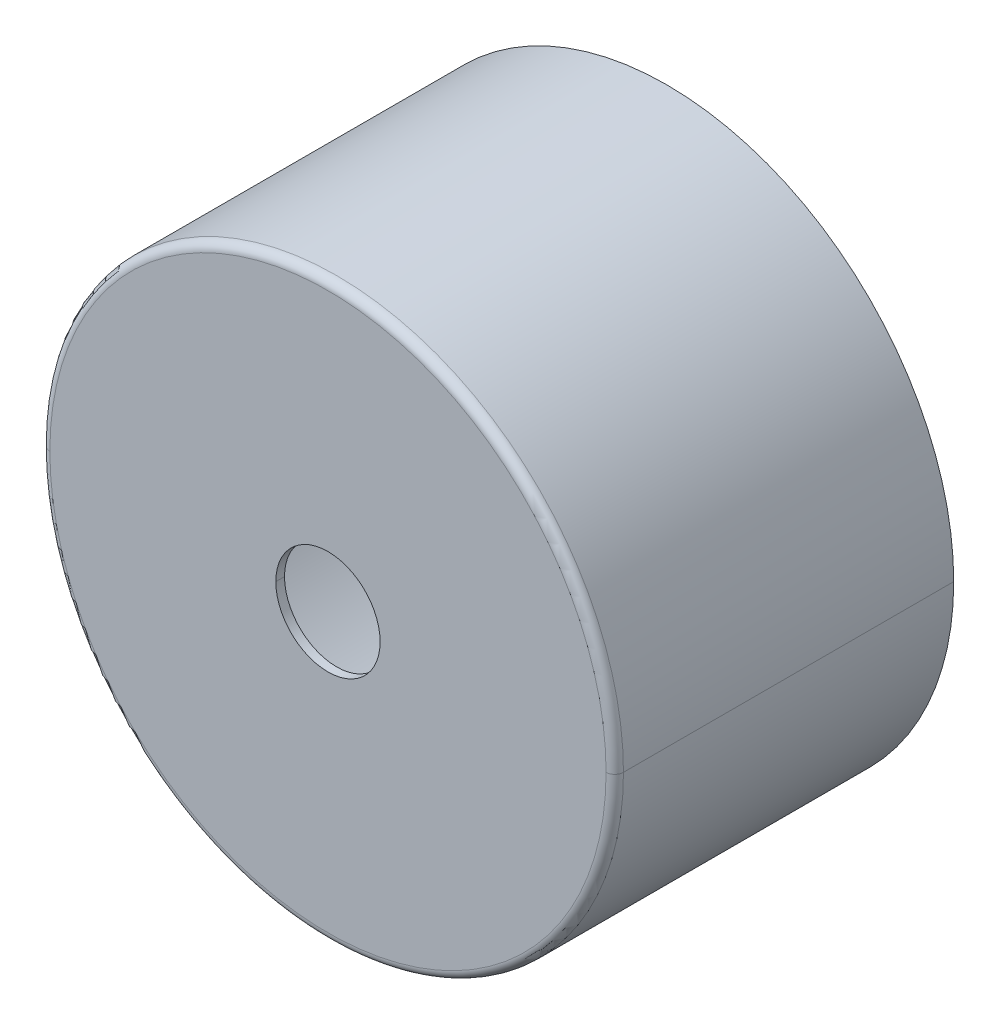
ISO-10303-21;
HEADER;
FILE_DESCRIPTION(('STEP AP214'),'2;1');
FILE_NAME('part.step','',(''),(''),'','','');
FILE_SCHEMA(('AUTOMOTIVE_DESIGN { 1 0 10303 214 1 1 1 1 }'));
ENDSEC;
DATA;
#1=APPLICATION_CONTEXT('core data for automotive mechanical design processes');
#2=APPLICATION_PROTOCOL_DEFINITION('international standard','automotive_design',2000,#1);
#3=PRODUCT_CONTEXT('',#1,'mechanical');
#4=PRODUCT('Part','Part','',(#3));
#5=PRODUCT_RELATED_PRODUCT_CATEGORY('part','',(#4));
#6=PRODUCT_DEFINITION_FORMATION('','',#4);
#7=PRODUCT_DEFINITION_CONTEXT('part definition',#1,'design');
#8=PRODUCT_DEFINITION('design','',#6,#7);
#9=PRODUCT_DEFINITION_SHAPE('','',#8);
#10=(LENGTH_UNIT() NAMED_UNIT(*) SI_UNIT(.MILLI.,.METRE.));
#11=(NAMED_UNIT(*) PLANE_ANGLE_UNIT() SI_UNIT($,.RADIAN.));
#12=(NAMED_UNIT(*) SI_UNIT($,.STERADIAN.) SOLID_ANGLE_UNIT());
#13=UNCERTAINTY_MEASURE_WITH_UNIT(LENGTH_MEASURE(1.E-05),#10,'distance_accuracy_value','');
#14=(GEOMETRIC_REPRESENTATION_CONTEXT(3) GLOBAL_UNCERTAINTY_ASSIGNED_CONTEXT((#13)) GLOBAL_UNIT_ASSIGNED_CONTEXT((#10,
#11,#12)) REPRESENTATION_CONTEXT('',''));
#15=CARTESIAN_POINT('',(0.,0.,0.));
#16=DIRECTION('',(0.,0.,1.));
#17=DIRECTION('',(1.,0.,0.));
#18=AXIS2_PLACEMENT_3D('',#15,#16,#17);
#19=CARTESIAN_POINT('',(0.,0.,-0.5));
#20=DIRECTION('',(0.,0.,1.));
#21=DIRECTION('',(1.,0.,0.));
#22=AXIS2_PLACEMENT_3D('',#19,#20,#21);
#23=TOROIDAL_SURFACE('',#22,16.,0.5);
#24=CARTESIAN_POINT('',(-16.,0.,-0.5));
#25=DIRECTION('',(0.,1.,0.));
#26=DIRECTION('',(-1.,0.,0.));
#27=AXIS2_PLACEMENT_3D('',#24,#25,#26);
#28=CIRCLE('',#27,0.5);
#29=CARTESIAN_POINT('',(-16.5,0.,-0.5));
#30=VERTEX_POINT('',#29);
#31=CARTESIAN_POINT('',(-16.,0.,0.));
#32=VERTEX_POINT('',#31);
#33=EDGE_CURVE('E132',#30,#32,#28,.T.);
#34=ORIENTED_EDGE('',*,*,#33,.F.);
#35=CARTESIAN_POINT('',(0.,0.,-0.5));
#36=DIRECTION('',(0.,0.,-1.));
#37=DIRECTION('',(1.,0.,0.));
#38=AXIS2_PLACEMENT_3D('',#35,#36,#37);
#39=CIRCLE('',#38,16.5);
#40=CARTESIAN_POINT('',(16.5,0.,-0.5));
#41=VERTEX_POINT('',#40);
#42=EDGE_CURVE('E168',#41,#30,#39,.T.);
#43=ORIENTED_EDGE('',*,*,#42,.F.);
#44=CARTESIAN_POINT('',(16.,0.,-0.5));
#45=DIRECTION('',(0.,-1.,0.));
#46=DIRECTION('',(0.,0.,-1.));
#47=AXIS2_PLACEMENT_3D('',#44,#45,#46);
#48=CIRCLE('',#47,0.5);
#49=CARTESIAN_POINT('',(16.,0.,0.));
#50=VERTEX_POINT('',#49);
#51=EDGE_CURVE('E120',#41,#50,#48,.T.);
#52=ORIENTED_EDGE('',*,*,#51,.T.);
#53=CARTESIAN_POINT('',(0.,0.,0.));
#54=DIRECTION('',(0.,0.,1.));
#55=DIRECTION('',(1.,0.,0.));
#56=AXIS2_PLACEMENT_3D('',#53,#54,#55);
#57=CIRCLE('',#56,16.);
#58=EDGE_CURVE('E21',#32,#50,#57,.T.);
#59=ORIENTED_EDGE('',*,*,#58,.F.);
#60=EDGE_LOOP('',(#34,#43,#52,#59));
#61=FACE_BOUND('',#60,.T.);
#62=ADVANCED_FACE('F17',(#61),#23,.T.);
#63=CARTESIAN_POINT('',(0.,0.,-19.5));
#64=DIRECTION('',(0.,0.,1.));
#65=DIRECTION('',(1.,0.,0.));
#66=AXIS2_PLACEMENT_3D('',#63,#64,#65);
#67=CYLINDRICAL_SURFACE('',#66,3.);
#68=DIRECTION('',(0.,0.,1.));
#69=VECTOR('',#68,1.);
#70=CARTESIAN_POINT('',(-3.,0.,-19.5));
#71=LINE('',#70,#69);
#72=CARTESIAN_POINT('',(-3.,0.,-0.5));
#73=VERTEX_POINT('',#72);
#74=CARTESIAN_POINT('',(-3.,0.,0.));
#75=VERTEX_POINT('',#74);
#76=EDGE_CURVE('E97',#73,#75,#71,.T.);
#77=ORIENTED_EDGE('',*,*,#76,.F.);
#78=CARTESIAN_POINT('',(0.,0.,-0.5));
#79=DIRECTION('',(0.,0.,1.));
#80=DIRECTION('',(1.,0.,0.));
#81=AXIS2_PLACEMENT_3D('',#78,#79,#80);
#82=CIRCLE('',#81,3.);
#83=CARTESIAN_POINT('',(3.,0.,-0.5));
#84=VERTEX_POINT('',#83);
#85=EDGE_CURVE('E11',#84,#73,#82,.T.);
#86=ORIENTED_EDGE('',*,*,#85,.F.);
#87=DIRECTION('',(0.,0.,1.));
#88=VECTOR('',#87,1.);
#89=CARTESIAN_POINT('',(3.,0.,-19.5));
#90=LINE('',#89,#88);
#91=CARTESIAN_POINT('',(3.,0.,0.));
#92=VERTEX_POINT('',#91);
#93=EDGE_CURVE('E100',#84,#92,#90,.T.);
#94=ORIENTED_EDGE('',*,*,#93,.T.);
#95=CARTESIAN_POINT('',(0.,0.,0.));
#96=DIRECTION('',(0.,0.,1.));
#97=DIRECTION('',(1.,0.,0.));
#98=AXIS2_PLACEMENT_3D('',#95,#96,#97);
#99=CIRCLE('',#98,3.);
#100=EDGE_CURVE('E94',#92,#75,#99,.T.);
#101=ORIENTED_EDGE('',*,*,#100,.T.);
#102=EDGE_LOOP('',(#77,#86,#94,#101));
#103=FACE_BOUND('',#102,.T.);
#104=ADVANCED_FACE('F19',(#103),#67,.F.);
#105=CARTESIAN_POINT('',(0.,0.,-0.5));
#106=DIRECTION('',(0.,0.,1.));
#107=DIRECTION('',(1.,0.,0.));
#108=AXIS2_PLACEMENT_3D('',#105,#106,#107);
#109=PLANE('',#108);
#110=ORIENTED_EDGE('',*,*,#85,.T.);
#111=CARTESIAN_POINT('',(0.,0.,-0.5));
#112=DIRECTION('',(0.,0.,1.));
#113=DIRECTION('',(1.,0.,0.));
#114=AXIS2_PLACEMENT_3D('',#111,#112,#113);
#115=CIRCLE('',#114,3.);
#116=EDGE_CURVE('E113',#73,#84,#115,.T.);
#117=ORIENTED_EDGE('',*,*,#116,.T.);
#118=EDGE_LOOP('',(#110,#117));
#119=FACE_BOUND('',#118,.T.);
#120=CARTESIAN_POINT('',(0.,0.,-0.5));
#121=DIRECTION('',(0.,0.,1.));
#122=DIRECTION('',(1.,0.,0.));
#123=AXIS2_PLACEMENT_3D('',#120,#121,#122);
#124=CIRCLE('',#123,16.);
#125=CARTESIAN_POINT('',(16.,0.,-0.5));
#126=VERTEX_POINT('',#125);
#127=CARTESIAN_POINT('',(-16.,0.,-0.5));
#128=VERTEX_POINT('',#127);
#129=EDGE_CURVE('E28',#126,#128,#124,.T.);
#130=ORIENTED_EDGE('',*,*,#129,.F.);
#131=CARTESIAN_POINT('',(0.,0.,-0.5));
#132=DIRECTION('',(0.,0.,1.));
#133=DIRECTION('',(1.,0.,0.));
#134=AXIS2_PLACEMENT_3D('',#131,#132,#133);
#135=CIRCLE('',#134,16.);
#136=EDGE_CURVE('E123',#128,#126,#135,.T.);
#137=ORIENTED_EDGE('',*,*,#136,.F.);
#138=EDGE_LOOP('',(#130,#137));
#139=FACE_BOUND('',#138,.T.);
#140=ADVANCED_FACE('F201',(#119,#139),#109,.F.);
#141=CARTESIAN_POINT('',(0.,0.,-19.5));
#142=DIRECTION('',(0.,0.,1.));
#143=DIRECTION('',(1.,0.,0.));
#144=AXIS2_PLACEMENT_3D('',#141,#142,#143);
#145=CYLINDRICAL_SURFACE('',#144,16.);
#146=DIRECTION('',(0.,0.,1.));
#147=VECTOR('',#146,1.);
#148=CARTESIAN_POINT('',(-16.,0.,-19.5));
#149=LINE('',#148,#147);
#150=CARTESIAN_POINT('',(-16.,0.,-19.5));
#151=VERTEX_POINT('',#150);
#152=EDGE_CURVE('E127',#151,#128,#149,.T.);
#153=ORIENTED_EDGE('',*,*,#152,.F.);
#154=CARTESIAN_POINT('',(0.,0.,-19.5));
#155=DIRECTION('',(0.,0.,1.));
#156=DIRECTION('',(1.,0.,0.));
#157=AXIS2_PLACEMENT_3D('',#154,#155,#156);
#158=CIRCLE('',#157,16.);
#159=CARTESIAN_POINT('',(16.,0.,-19.5));
#160=VERTEX_POINT('',#159);
#161=EDGE_CURVE('E171',#160,#151,#158,.T.);
#162=ORIENTED_EDGE('',*,*,#161,.F.);
#163=DIRECTION('',(0.,0.,1.));
#164=VECTOR('',#163,1.);
#165=CARTESIAN_POINT('',(16.,0.,-19.5));
#166=LINE('',#165,#164);
#167=EDGE_CURVE('E126',#160,#126,#166,.T.);
#168=ORIENTED_EDGE('',*,*,#167,.T.);
#169=ORIENTED_EDGE('',*,*,#129,.T.);
#170=EDGE_LOOP('',(#153,#162,#168,#169));
#171=FACE_BOUND('',#170,.T.);
#172=ADVANCED_FACE('F192',(#171),#145,.F.);
#173=CARTESIAN_POINT('',(0.,0.,0.));
#174=DIRECTION('',(0.,0.,1.));
#175=DIRECTION('',(1.,0.,0.));
#176=AXIS2_PLACEMENT_3D('',#173,#174,#175);
#177=PLANE('',#176);
#178=ORIENTED_EDGE('',*,*,#100,.F.);
#179=CARTESIAN_POINT('',(0.,0.,0.));
#180=DIRECTION('',(0.,0.,1.));
#181=DIRECTION('',(1.,0.,0.));
#182=AXIS2_PLACEMENT_3D('',#179,#180,#181);
#183=CIRCLE('',#182,3.);
#184=EDGE_CURVE('E105',#75,#92,#183,.T.);
#185=ORIENTED_EDGE('',*,*,#184,.F.);
#186=EDGE_LOOP('',(#178,#185));
#187=FACE_BOUND('',#186,.T.);
#188=CARTESIAN_POINT('',(0.,0.,0.));
#189=DIRECTION('',(0.,0.,1.));
#190=DIRECTION('',(1.,0.,0.));
#191=AXIS2_PLACEMENT_3D('',#188,#189,#190);
#192=CIRCLE('',#191,16.);
#193=EDGE_CURVE('E136',#50,#32,#192,.T.);
#194=ORIENTED_EDGE('',*,*,#193,.T.);
#195=ORIENTED_EDGE('',*,*,#58,.T.);
#196=EDGE_LOOP('',(#194,#195));
#197=FACE_BOUND('',#196,.T.);
#198=ADVANCED_FACE('F106',(#187,#197),#177,.T.);
#199=CARTESIAN_POINT('',(0.,0.,-19.5));
#200=DIRECTION('',(0.,0.,1.));
#201=DIRECTION('',(1.,0.,0.));
#202=AXIS2_PLACEMENT_3D('',#199,#200,#201);
#203=PLANE('',#202);
#204=ORIENTED_EDGE('',*,*,#161,.T.);
#205=CARTESIAN_POINT('',(0.,0.,-19.5));
#206=DIRECTION('',(0.,0.,1.));
#207=DIRECTION('',(1.,0.,0.));
#208=AXIS2_PLACEMENT_3D('',#205,#206,#207);
#209=CIRCLE('',#208,16.);
#210=EDGE_CURVE('E131',#151,#160,#209,.T.);
#211=ORIENTED_EDGE('',*,*,#210,.T.);
#212=EDGE_LOOP('',(#204,#211));
#213=FACE_BOUND('',#212,.T.);
#214=CARTESIAN_POINT('',(0.,0.,-19.5));
#215=DIRECTION('',(0.,0.,1.));
#216=DIRECTION('',(1.,0.,0.));
#217=AXIS2_PLACEMENT_3D('',#214,#215,#216);
#218=CIRCLE('',#217,16.5);
#219=CARTESIAN_POINT('',(16.5,0.,-19.5));
#220=VERTEX_POINT('',#219);
#221=CARTESIAN_POINT('',(-16.5,0.,-19.5));
#222=VERTEX_POINT('',#221);
#223=EDGE_CURVE('E145',#220,#222,#218,.T.);
#224=ORIENTED_EDGE('',*,*,#223,.F.);
#225=CARTESIAN_POINT('',(0.,0.,-19.5));
#226=DIRECTION('',(0.,0.,1.));
#227=DIRECTION('',(1.,0.,0.));
#228=AXIS2_PLACEMENT_3D('',#225,#226,#227);
#229=CIRCLE('',#228,16.5);
#230=EDGE_CURVE('E42',#222,#220,#229,.T.);
#231=ORIENTED_EDGE('',*,*,#230,.F.);
#232=EDGE_LOOP('',(#224,#231));
#233=FACE_BOUND('',#232,.T.);
#234=ADVANCED_FACE('F191',(#213,#233),#203,.F.);
#235=CARTESIAN_POINT('',(0.,0.,-19.5));
#236=DIRECTION('',(0.,0.,1.));
#237=DIRECTION('',(1.,0.,0.));
#238=AXIS2_PLACEMENT_3D('',#235,#236,#237);
#239=CYLINDRICAL_SURFACE('',#238,16.5);
#240=DIRECTION('',(0.,0.,1.));
#241=VECTOR('',#240,1.);
#242=CARTESIAN_POINT('',(-16.5,0.,-19.5));
#243=LINE('',#242,#241);
#244=EDGE_CURVE('E140',#222,#30,#243,.T.);
#245=ORIENTED_EDGE('',*,*,#244,.F.);
#246=ORIENTED_EDGE('',*,*,#230,.T.);
#247=DIRECTION('',(0.,0.,1.));
#248=VECTOR('',#247,1.);
#249=CARTESIAN_POINT('',(16.5,0.,-19.5));
#250=LINE('',#249,#248);
#251=EDGE_CURVE('E144',#220,#41,#250,.T.);
#252=ORIENTED_EDGE('',*,*,#251,.T.);
#253=ORIENTED_EDGE('',*,*,#42,.T.);
#254=EDGE_LOOP('',(#245,#246,#252,#253));
#255=FACE_BOUND('',#254,.T.);
#256=ADVANCED_FACE('F181',(#255),#239,.T.);
#257=CARTESIAN_POINT('',(0.,0.,-19.5));
#258=DIRECTION('',(0.,0.,1.));
#259=DIRECTION('',(1.,0.,0.));
#260=AXIS2_PLACEMENT_3D('',#257,#258,#259);
#261=CYLINDRICAL_SURFACE('',#260,16.5);
#262=ORIENTED_EDGE('',*,*,#223,.T.);
#263=ORIENTED_EDGE('',*,*,#244,.T.);
#264=CARTESIAN_POINT('',(0.,0.,-0.5));
#265=DIRECTION('',(0.,0.,-1.));
#266=DIRECTION('',(1.,0.,0.));
#267=AXIS2_PLACEMENT_3D('',#264,#265,#266);
#268=CIRCLE('',#267,16.5);
#269=EDGE_CURVE('E137',#30,#41,#268,.T.);
#270=ORIENTED_EDGE('',*,*,#269,.T.);
#271=ORIENTED_EDGE('',*,*,#251,.F.);
#272=EDGE_LOOP('',(#262,#263,#270,#271));
#273=FACE_BOUND('',#272,.T.);
#274=ADVANCED_FACE('F188',(#273),#261,.T.);
#275=CARTESIAN_POINT('',(0.,0.,-19.5));
#276=DIRECTION('',(0.,0.,1.));
#277=DIRECTION('',(1.,0.,0.));
#278=AXIS2_PLACEMENT_3D('',#275,#276,#277);
#279=CYLINDRICAL_SURFACE('',#278,16.);
#280=ORIENTED_EDGE('',*,*,#210,.F.);
#281=ORIENTED_EDGE('',*,*,#152,.T.);
#282=ORIENTED_EDGE('',*,*,#136,.T.);
#283=ORIENTED_EDGE('',*,*,#167,.F.);
#284=EDGE_LOOP('',(#280,#281,#282,#283));
#285=FACE_BOUND('',#284,.T.);
#286=ADVANCED_FACE('F215',(#285),#279,.F.);
#287=CARTESIAN_POINT('',(0.,0.,-19.5));
#288=DIRECTION('',(0.,0.,1.));
#289=DIRECTION('',(1.,0.,0.));
#290=AXIS2_PLACEMENT_3D('',#287,#288,#289);
#291=CYLINDRICAL_SURFACE('',#290,3.);
#292=ORIENTED_EDGE('',*,*,#116,.F.);
#293=ORIENTED_EDGE('',*,*,#76,.T.);
#294=ORIENTED_EDGE('',*,*,#184,.T.);
#295=ORIENTED_EDGE('',*,*,#93,.F.);
#296=EDGE_LOOP('',(#292,#293,#294,#295));
#297=FACE_BOUND('',#296,.T.);
#298=ADVANCED_FACE('F111',(#297),#291,.F.);
#299=CARTESIAN_POINT('',(0.,0.,-0.5));
#300=DIRECTION('',(0.,0.,1.));
#301=DIRECTION('',(1.,0.,0.));
#302=AXIS2_PLACEMENT_3D('',#299,#300,#301);
#303=TOROIDAL_SURFACE('',#302,16.,0.5);
#304=ORIENTED_EDGE('',*,*,#269,.F.);
#305=ORIENTED_EDGE('',*,*,#33,.T.);
#306=ORIENTED_EDGE('',*,*,#193,.F.);
#307=ORIENTED_EDGE('',*,*,#51,.F.);
#308=EDGE_LOOP('',(#304,#305,#306,#307));
#309=FACE_BOUND('',#308,.T.);
#310=ADVANCED_FACE('F186',(#309),#303,.T.);
#311=CLOSED_SHELL('',(#62,#104,#140,#172,#198,#234,#256,#274,#286,#298,#310));
#312=MANIFOLD_SOLID_BREP('B1',#311);
#313=ADVANCED_BREP_SHAPE_REPRESENTATION('',(#18,#312),#14);
#314=SHAPE_DEFINITION_REPRESENTATION(#9,#313);
ENDSEC;
END-ISO-10303-21;
